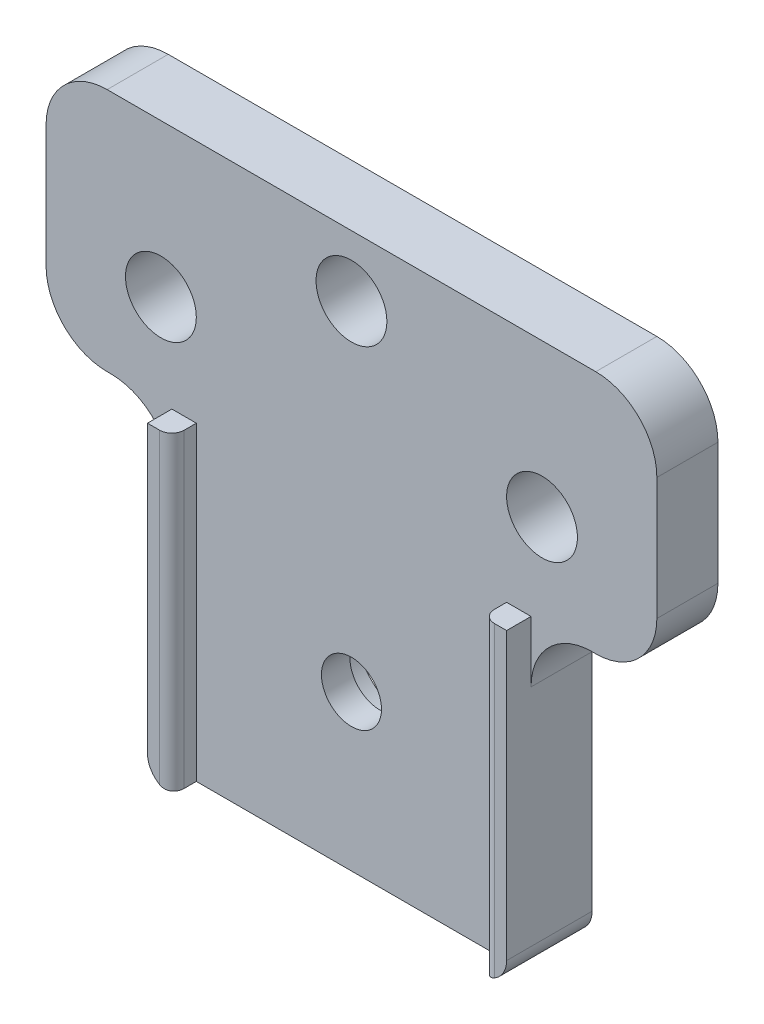
ISO-10303-21;
HEADER;
FILE_DESCRIPTION(('STEP AP214'),'2;1');
FILE_NAME('part.step','',(''),(''),'','','');
FILE_SCHEMA(('AUTOMOTIVE_DESIGN { 1 0 10303 214 1 1 1 1 }'));
ENDSEC;
DATA;
#1=APPLICATION_CONTEXT('core data for automotive mechanical design processes');
#2=APPLICATION_PROTOCOL_DEFINITION('international standard','automotive_design',2000,#1);
#3=PRODUCT_CONTEXT('',#1,'mechanical');
#4=PRODUCT('Part','Part','',(#3));
#5=PRODUCT_RELATED_PRODUCT_CATEGORY('part','',(#4));
#6=PRODUCT_DEFINITION_FORMATION('','',#4);
#7=PRODUCT_DEFINITION_CONTEXT('part definition',#1,'design');
#8=PRODUCT_DEFINITION('design','',#6,#7);
#9=PRODUCT_DEFINITION_SHAPE('','',#8);
#10=(LENGTH_UNIT() NAMED_UNIT(*) SI_UNIT(.MILLI.,.METRE.));
#11=(NAMED_UNIT(*) PLANE_ANGLE_UNIT() SI_UNIT($,.RADIAN.));
#12=(NAMED_UNIT(*) SI_UNIT($,.STERADIAN.) SOLID_ANGLE_UNIT());
#13=UNCERTAINTY_MEASURE_WITH_UNIT(LENGTH_MEASURE(1.E-05),#10,'distance_accuracy_value','');
#14=(GEOMETRIC_REPRESENTATION_CONTEXT(3) GLOBAL_UNCERTAINTY_ASSIGNED_CONTEXT((#13)) GLOBAL_UNIT_ASSIGNED_CONTEXT((#10,
#11,#12)) REPRESENTATION_CONTEXT('',''));
#15=CARTESIAN_POINT('',(0.,0.,0.));
#16=DIRECTION('',(0.,0.,1.));
#17=DIRECTION('',(1.,0.,0.));
#18=AXIS2_PLACEMENT_3D('',#15,#16,#17);
#19=CARTESIAN_POINT('',(0.,0.,5.));
#20=DIRECTION('',(0.,0.,1.));
#21=DIRECTION('',(1.,0.,0.));
#22=AXIS2_PLACEMENT_3D('',#19,#20,#21);
#23=PLANE('',#22);
#24=CARTESIAN_POINT('',(-15.6,12.7,5.));
#25=DIRECTION('',(0.,0.,1.));
#26=DIRECTION('',(1.,0.,0.));
#27=AXIS2_PLACEMENT_3D('',#24,#25,#26);
#28=CIRCLE('',#27,2.9);
#29=CARTESIAN_POINT('',(-12.7,12.7,5.));
#30=VERTEX_POINT('',#29);
#31=EDGE_CURVE('E550',#30,#30,#28,.T.);
#32=ORIENTED_EDGE('',*,*,#31,.F.);
#33=EDGE_LOOP('',(#32));
#34=FACE_BOUND('',#33,.T.);
#35=CARTESIAN_POINT('',(15.6,12.7,5.));
#36=DIRECTION('',(0.,0.,1.));
#37=DIRECTION('',(1.,0.,0.));
#38=AXIS2_PLACEMENT_3D('',#35,#36,#37);
#39=CIRCLE('',#38,2.9);
#40=CARTESIAN_POINT('',(18.5,12.7,5.));
#41=VERTEX_POINT('',#40);
#42=EDGE_CURVE('E552',#41,#41,#39,.T.);
#43=ORIENTED_EDGE('',*,*,#42,.F.);
#44=EDGE_LOOP('',(#43));
#45=FACE_BOUND('',#44,.T.);
#46=CARTESIAN_POINT('',(0.,20.2,5.));
#47=DIRECTION('',(0.,0.,1.));
#48=DIRECTION('',(1.,0.,0.));
#49=AXIS2_PLACEMENT_3D('',#46,#47,#48);
#50=CIRCLE('',#49,2.9);
#51=CARTESIAN_POINT('',(2.9,20.2,5.));
#52=VERTEX_POINT('',#51);
#53=EDGE_CURVE('E441',#52,#52,#50,.T.);
#54=ORIENTED_EDGE('',*,*,#53,.F.);
#55=EDGE_LOOP('',(#54));
#56=FACE_BOUND('',#55,.T.);
#57=CARTESIAN_POINT('',(0.,-7.49999999999999,5.));
#58=DIRECTION('',(0.,0.,1.));
#59=DIRECTION('',(1.,0.,0.));
#60=AXIS2_PLACEMENT_3D('',#57,#58,#59);
#61=CIRCLE('',#60,2.45745);
#62=CARTESIAN_POINT('',(2.45745,-7.49999999999999,5.));
#63=VERTEX_POINT('',#62);
#64=EDGE_CURVE('E415',#63,#63,#61,.T.);
#65=ORIENTED_EDGE('',*,*,#64,.F.);
#66=EDGE_LOOP('',(#65));
#67=FACE_BOUND('',#66,.T.);
#68=DIRECTION('',(0.,1.,0.));
#69=VECTOR('',#68,1.);
#70=CARTESIAN_POINT('',(25.,5.2,5.));
#71=LINE('',#70,#69);
#72=CARTESIAN_POINT('',(25.,10.2,5.));
#73=VERTEX_POINT('',#72);
#74=CARTESIAN_POINT('',(25.,20.2,5.));
#75=VERTEX_POINT('',#74);
#76=EDGE_CURVE('E456',#73,#75,#71,.T.);
#77=ORIENTED_EDGE('',*,*,#76,.T.);
#78=CARTESIAN_POINT('',(20.,20.2,5.));
#79=DIRECTION('',(0.,0.,1.));
#80=DIRECTION('',(1.,0.,0.));
#81=AXIS2_PLACEMENT_3D('',#78,#79,#80);
#82=CIRCLE('',#81,5.);
#83=CARTESIAN_POINT('',(20.,25.2,5.));
#84=VERTEX_POINT('',#83);
#85=EDGE_CURVE('E341',#75,#84,#82,.T.);
#86=ORIENTED_EDGE('',*,*,#85,.T.);
#87=DIRECTION('',(1.,0.,0.));
#88=VECTOR('',#87,1.);
#89=CARTESIAN_POINT('',(-25.,25.2,5.));
#90=LINE('',#89,#88);
#91=CARTESIAN_POINT('',(-20.,25.2,5.));
#92=VERTEX_POINT('',#91);
#93=EDGE_CURVE('E426',#92,#84,#90,.T.);
#94=ORIENTED_EDGE('',*,*,#93,.F.);
#95=CARTESIAN_POINT('',(-20.,20.2,5.));
#96=DIRECTION('',(0.,0.,1.));
#97=DIRECTION('',(1.,0.,0.));
#98=AXIS2_PLACEMENT_3D('',#95,#96,#97);
#99=CIRCLE('',#98,5.);
#100=CARTESIAN_POINT('',(-25.,20.2,5.));
#101=VERTEX_POINT('',#100);
#102=EDGE_CURVE('E339',#92,#101,#99,.T.);
#103=ORIENTED_EDGE('',*,*,#102,.T.);
#104=DIRECTION('',(0.,-1.,0.));
#105=VECTOR('',#104,1.);
#106=CARTESIAN_POINT('',(-25.,5.2,5.));
#107=LINE('',#106,#105);
#108=CARTESIAN_POINT('',(-25.,10.2,5.));
#109=VERTEX_POINT('',#108);
#110=EDGE_CURVE('E417',#101,#109,#107,.T.);
#111=ORIENTED_EDGE('',*,*,#110,.T.);
#112=CARTESIAN_POINT('',(-20.,10.2,5.));
#113=DIRECTION('',(0.,0.,1.));
#114=DIRECTION('',(1.,0.,0.));
#115=AXIS2_PLACEMENT_3D('',#112,#113,#114);
#116=CIRCLE('',#115,5.);
#117=CARTESIAN_POINT('',(-20.,5.2,5.));
#118=VERTEX_POINT('',#117);
#119=EDGE_CURVE('E335',#109,#118,#116,.T.);
#120=ORIENTED_EDGE('',*,*,#119,.T.);
#121=DIRECTION('',(1.,0.,0.));
#122=VECTOR('',#121,1.);
#123=CARTESIAN_POINT('',(25.,5.2,5.));
#124=LINE('',#123,#122);
#125=CARTESIAN_POINT('',(-19.7,5.2,5.));
#126=VERTEX_POINT('',#125);
#127=EDGE_CURVE('E461',#118,#126,#124,.T.);
#128=ORIENTED_EDGE('',*,*,#127,.T.);
#129=CARTESIAN_POINT('',(-19.7,0.200000000000006,5.));
#130=DIRECTION('',(0.,0.,1.));
#131=DIRECTION('',(1.,0.,0.));
#132=AXIS2_PLACEMENT_3D('',#129,#130,#131);
#133=CIRCLE('',#132,5.);
#134=CARTESIAN_POINT('',(-14.7,0.200000000000006,5.));
#135=VERTEX_POINT('',#134);
#136=EDGE_CURVE('E367',#126,#135,#133,.F.);
#137=ORIENTED_EDGE('',*,*,#136,.T.);
#138=DIRECTION('',(0.,-1.,0.));
#139=VECTOR('',#138,1.);
#140=CARTESIAN_POINT('',(-14.7,-20.2,5.));
#141=LINE('',#140,#139);
#142=CARTESIAN_POINT('',(-14.7,5.20000000000001,5.));
#143=VERTEX_POINT('',#142);
#144=EDGE_CURVE('E346',#143,#135,#141,.T.);
#145=ORIENTED_EDGE('',*,*,#144,.F.);
#146=DIRECTION('',(1.,0.,0.));
#147=VECTOR('',#146,1.);
#148=CARTESIAN_POINT('',(-14.7,5.20000000000001,5.));
#149=LINE('',#148,#147);
#150=CARTESIAN_POINT('',(-12.7,5.20000000000001,5.));
#151=VERTEX_POINT('',#150);
#152=EDGE_CURVE('E489',#143,#151,#149,.T.);
#153=ORIENTED_EDGE('',*,*,#152,.T.);
#154=DIRECTION('',(0.,-1.,0.));
#155=VECTOR('',#154,1.);
#156=CARTESIAN_POINT('',(-12.7,5.20000000000001,5.));
#157=LINE('',#156,#155);
#158=CARTESIAN_POINT('',(-12.7,-20.2,5.));
#159=VERTEX_POINT('',#158);
#160=EDGE_CURVE('E405',#151,#159,#157,.T.);
#161=ORIENTED_EDGE('',*,*,#160,.T.);
#162=DIRECTION('',(1.,0.,0.));
#163=VECTOR('',#162,1.);
#164=CARTESIAN_POINT('',(14.7,-20.2,5.));
#165=LINE('',#164,#163);
#166=CARTESIAN_POINT('',(12.7,-20.2,5.));
#167=VERTEX_POINT('',#166);
#168=EDGE_CURVE('E385',#159,#167,#165,.T.);
#169=ORIENTED_EDGE('',*,*,#168,.T.);
#170=DIRECTION('',(0.,-1.,0.));
#171=VECTOR('',#170,1.);
#172=CARTESIAN_POINT('',(12.7,5.20000000000001,5.));
#173=LINE('',#172,#171);
#174=CARTESIAN_POINT('',(12.7,5.20000000000001,5.));
#175=VERTEX_POINT('',#174);
#176=EDGE_CURVE('E202',#175,#167,#173,.T.);
#177=ORIENTED_EDGE('',*,*,#176,.F.);
#178=DIRECTION('',(-1.,0.,0.));
#179=VECTOR('',#178,1.);
#180=CARTESIAN_POINT('',(14.7,5.20000000000001,5.));
#181=LINE('',#180,#179);
#182=CARTESIAN_POINT('',(14.7,5.20000000000001,5.));
#183=VERTEX_POINT('',#182);
#184=EDGE_CURVE('E476',#183,#175,#181,.T.);
#185=ORIENTED_EDGE('',*,*,#184,.F.);
#186=DIRECTION('',(0.,1.,0.));
#187=VECTOR('',#186,1.);
#188=CARTESIAN_POINT('',(14.7,-20.2,5.));
#189=LINE('',#188,#187);
#190=CARTESIAN_POINT('',(14.7,0.200000000000006,5.));
#191=VERTEX_POINT('',#190);
#192=EDGE_CURVE('E355',#191,#183,#189,.T.);
#193=ORIENTED_EDGE('',*,*,#192,.F.);
#194=CARTESIAN_POINT('',(19.7,0.200000000000006,5.));
#195=DIRECTION('',(0.,0.,1.));
#196=DIRECTION('',(1.,0.,0.));
#197=AXIS2_PLACEMENT_3D('',#194,#195,#196);
#198=CIRCLE('',#197,5.);
#199=CARTESIAN_POINT('',(19.7,5.2,5.));
#200=VERTEX_POINT('',#199);
#201=EDGE_CURVE('E369',#191,#200,#198,.F.);
#202=ORIENTED_EDGE('',*,*,#201,.T.);
#203=CARTESIAN_POINT('',(20.,5.2,5.));
#204=VERTEX_POINT('',#203);
#205=EDGE_CURVE('E460',#200,#204,#124,.T.);
#206=ORIENTED_EDGE('',*,*,#205,.T.);
#207=CARTESIAN_POINT('',(20.,10.2,5.));
#208=DIRECTION('',(0.,0.,1.));
#209=DIRECTION('',(1.,0.,0.));
#210=AXIS2_PLACEMENT_3D('',#207,#208,#209);
#211=CIRCLE('',#210,5.);
#212=EDGE_CURVE('E337',#204,#73,#211,.T.);
#213=ORIENTED_EDGE('',*,*,#212,.T.);
#214=EDGE_LOOP('',(#77,#86,#94,#103,#111,#120,#128,#137,#145,#153,#161,#169,#177,#185,#193,#202,
#206,#213));
#215=FACE_BOUND('',#214,.T.);
#216=ADVANCED_FACE('F33',(#34,#45,#56,#67,#215),#23,.T.);
#217=CARTESIAN_POINT('',(-14.7,-20.2,5.));
#218=DIRECTION('',(1.,0.,0.));
#219=DIRECTION('',(0.,0.,-1.));
#220=AXIS2_PLACEMENT_3D('',#217,#218,#219);
#221=PLANE('',#220);
#222=DIRECTION('',(0.,-1.,0.));
#223=VECTOR('',#222,1.);
#224=CARTESIAN_POINT('',(-14.7,-20.2,0.));
#225=LINE('',#224,#223);
#226=CARTESIAN_POINT('',(-14.7,0.200000000000006,0.));
#227=VERTEX_POINT('',#226);
#228=CARTESIAN_POINT('',(-14.7,-18.2,0.));
#229=VERTEX_POINT('',#228);
#230=EDGE_CURVE('E393',#227,#229,#225,.T.);
#231=ORIENTED_EDGE('',*,*,#230,.T.);
#232=DIRECTION('',(0.,0.,-1.));
#233=VECTOR('',#232,1.);
#234=CARTESIAN_POINT('',(-14.7,-18.2,5.));
#235=LINE('',#234,#233);
#236=CARTESIAN_POINT('',(-14.7,-18.2,7.));
#237=VERTEX_POINT('',#236);
#238=EDGE_CURVE('E61',#229,#237,#235,.F.);
#239=ORIENTED_EDGE('',*,*,#238,.T.);
#240=DIRECTION('',(0.,-1.,0.));
#241=VECTOR('',#240,1.);
#242=CARTESIAN_POINT('',(-14.7,5.20000000000001,7.));
#243=LINE('',#242,#241);
#244=CARTESIAN_POINT('',(-14.7,5.20000000000001,7.));
#245=VERTEX_POINT('',#244);
#246=EDGE_CURVE('E408',#245,#237,#243,.T.);
#247=ORIENTED_EDGE('',*,*,#246,.F.);
#248=DIRECTION('',(0.,0.,1.));
#249=VECTOR('',#248,1.);
#250=CARTESIAN_POINT('',(-14.7,5.20000000000001,5.));
#251=LINE('',#250,#249);
#252=EDGE_CURVE('E492',#143,#245,#251,.T.);
#253=ORIENTED_EDGE('',*,*,#252,.F.);
#254=ORIENTED_EDGE('',*,*,#144,.T.);
#255=DIRECTION('',(0.,0.,-1.));
#256=VECTOR('',#255,1.);
#257=CARTESIAN_POINT('',(-14.7,0.200000000000006,5.));
#258=LINE('',#257,#256);
#259=EDGE_CURVE('E349',#135,#227,#258,.T.);
#260=ORIENTED_EDGE('',*,*,#259,.T.);
#261=EDGE_LOOP('',(#231,#239,#247,#253,#254,#260));
#262=FACE_BOUND('',#261,.T.);
#263=ADVANCED_FACE('F266',(#262),#221,.F.);
#264=CARTESIAN_POINT('',(14.7,-20.2,5.));
#265=DIRECTION('',(0.,1.,0.));
#266=DIRECTION('',(-1.,0.,0.));
#267=AXIS2_PLACEMENT_3D('',#264,#265,#266);
#268=PLANE('',#267);
#269=DIRECTION('',(1.,0.,0.));
#270=VECTOR('',#269,1.);
#271=CARTESIAN_POINT('',(14.7,-20.2,0.));
#272=LINE('',#271,#270);
#273=CARTESIAN_POINT('',(-12.7,-20.2,0.));
#274=VERTEX_POINT('',#273);
#275=CARTESIAN_POINT('',(12.7,-20.2,0.));
#276=VERTEX_POINT('',#275);
#277=EDGE_CURVE('E383',#274,#276,#272,.T.);
#278=ORIENTED_EDGE('',*,*,#277,.T.);
#279=DIRECTION('',(0.,0.,-1.));
#280=VECTOR('',#279,1.);
#281=CARTESIAN_POINT('',(12.7,-20.2,5.));
#282=LINE('',#281,#280);
#283=EDGE_CURVE('E221',#276,#167,#282,.F.);
#284=ORIENTED_EDGE('',*,*,#283,.T.);
#285=ORIENTED_EDGE('',*,*,#168,.F.);
#286=DIRECTION('',(0.,0.,-1.));
#287=VECTOR('',#286,1.);
#288=CARTESIAN_POINT('',(-12.7,-20.2,5.));
#289=LINE('',#288,#287);
#290=EDGE_CURVE('E224',#159,#274,#289,.T.);
#291=ORIENTED_EDGE('',*,*,#290,.T.);
#292=EDGE_LOOP('',(#278,#284,#285,#291));
#293=FACE_BOUND('',#292,.T.);
#294=ADVANCED_FACE('F274',(#293),#268,.F.);
#295=CARTESIAN_POINT('',(14.7,-20.2,5.));
#296=DIRECTION('',(-1.,0.,0.));
#297=DIRECTION('',(0.,0.,1.));
#298=AXIS2_PLACEMENT_3D('',#295,#296,#297);
#299=PLANE('',#298);
#300=DIRECTION('',(0.,-1.,0.));
#301=VECTOR('',#300,1.);
#302=CARTESIAN_POINT('',(14.7,5.20000000000001,7.));
#303=LINE('',#302,#301);
#304=CARTESIAN_POINT('',(14.7,5.20000000000001,7.));
#305=VERTEX_POINT('',#304);
#306=CARTESIAN_POINT('',(14.7,-18.2,7.));
#307=VERTEX_POINT('',#306);
#308=EDGE_CURVE('E468',#305,#307,#303,.T.);
#309=ORIENTED_EDGE('',*,*,#308,.T.);
#310=DIRECTION('',(0.,0.,-1.));
#311=VECTOR('',#310,1.);
#312=CARTESIAN_POINT('',(14.7,-18.2,5.));
#313=LINE('',#312,#311);
#314=CARTESIAN_POINT('',(14.7,-18.2,0.));
#315=VERTEX_POINT('',#314);
#316=EDGE_CURVE('E374',#307,#315,#313,.T.);
#317=ORIENTED_EDGE('',*,*,#316,.T.);
#318=DIRECTION('',(0.,1.,0.));
#319=VECTOR('',#318,1.);
#320=CARTESIAN_POINT('',(14.7,-20.2,0.));
#321=LINE('',#320,#319);
#322=CARTESIAN_POINT('',(14.7,0.200000000000006,0.));
#323=VERTEX_POINT('',#322);
#324=EDGE_CURVE('E392',#315,#323,#321,.T.);
#325=ORIENTED_EDGE('',*,*,#324,.T.);
#326=DIRECTION('',(0.,0.,1.));
#327=VECTOR('',#326,1.);
#328=CARTESIAN_POINT('',(14.7,0.200000000000006,5.));
#329=LINE('',#328,#327);
#330=EDGE_CURVE('E357',#323,#191,#329,.T.);
#331=ORIENTED_EDGE('',*,*,#330,.T.);
#332=ORIENTED_EDGE('',*,*,#192,.T.);
#333=DIRECTION('',(0.,0.,1.));
#334=VECTOR('',#333,1.);
#335=CARTESIAN_POINT('',(14.7,5.20000000000001,5.));
#336=LINE('',#335,#334);
#337=EDGE_CURVE('E469',#183,#305,#336,.T.);
#338=ORIENTED_EDGE('',*,*,#337,.T.);
#339=EDGE_LOOP('',(#309,#317,#325,#331,#332,#338));
#340=FACE_BOUND('',#339,.T.);
#341=ADVANCED_FACE('F270',(#340),#299,.F.);
#342=CARTESIAN_POINT('',(0.,0.,0.));
#343=DIRECTION('',(0.,0.,1.));
#344=DIRECTION('',(1.,0.,0.));
#345=AXIS2_PLACEMENT_3D('',#342,#343,#344);
#346=PLANE('',#345);
#347=CARTESIAN_POINT('',(-15.6,12.7,0.));
#348=DIRECTION('',(0.,0.,1.));
#349=DIRECTION('',(1.,0.,0.));
#350=AXIS2_PLACEMENT_3D('',#347,#348,#349);
#351=CIRCLE('',#350,2.9);
#352=CARTESIAN_POINT('',(-12.7,12.7,0.));
#353=VERTEX_POINT('',#352);
#354=EDGE_CURVE('E547',#353,#353,#351,.T.);
#355=ORIENTED_EDGE('',*,*,#354,.T.);
#356=EDGE_LOOP('',(#355));
#357=FACE_BOUND('',#356,.T.);
#358=CARTESIAN_POINT('',(15.6,12.7,0.));
#359=DIRECTION('',(0.,0.,1.));
#360=DIRECTION('',(1.,0.,0.));
#361=AXIS2_PLACEMENT_3D('',#358,#359,#360);
#362=CIRCLE('',#361,2.9);
#363=CARTESIAN_POINT('',(18.5,12.7,0.));
#364=VERTEX_POINT('',#363);
#365=EDGE_CURVE('E557',#364,#364,#362,.T.);
#366=ORIENTED_EDGE('',*,*,#365,.T.);
#367=EDGE_LOOP('',(#366));
#368=FACE_BOUND('',#367,.T.);
#369=CARTESIAN_POINT('',(0.,20.2,0.));
#370=DIRECTION('',(0.,0.,1.));
#371=DIRECTION('',(1.,0.,0.));
#372=AXIS2_PLACEMENT_3D('',#369,#370,#371);
#373=CIRCLE('',#372,2.9);
#374=CARTESIAN_POINT('',(2.9,20.2,0.));
#375=VERTEX_POINT('',#374);
#376=EDGE_CURVE('E436',#375,#375,#373,.T.);
#377=ORIENTED_EDGE('',*,*,#376,.T.);
#378=EDGE_LOOP('',(#377));
#379=FACE_BOUND('',#378,.T.);
#380=CARTESIAN_POINT('',(0.,-7.49999999999999,0.));
#381=DIRECTION('',(0.,0.,-1.));
#382=DIRECTION('',(-1.,0.,0.));
#383=AXIS2_PLACEMENT_3D('',#380,#381,#382);
#384=CIRCLE('',#383,4.76249999999999);
#385=CARTESIAN_POINT('',(-4.76249999999999,-7.49999999999999,0.));
#386=VERTEX_POINT('',#385);
#387=EDGE_CURVE('E438',#386,#386,#384,.T.);
#388=ORIENTED_EDGE('',*,*,#387,.F.);
#389=EDGE_LOOP('',(#388));
#390=FACE_BOUND('',#389,.T.);
#391=ORIENTED_EDGE('',*,*,#324,.F.);
#392=CARTESIAN_POINT('',(12.7,-18.2,0.));
#393=DIRECTION('',(0.,0.,1.));
#394=DIRECTION('',(1.,0.,0.));
#395=AXIS2_PLACEMENT_3D('',#392,#393,#394);
#396=CIRCLE('',#395,2.);
#397=EDGE_CURVE('E379',#315,#276,#396,.F.);
#398=ORIENTED_EDGE('',*,*,#397,.T.);
#399=ORIENTED_EDGE('',*,*,#277,.F.);
#400=CARTESIAN_POINT('',(-12.7,-18.2,0.));
#401=DIRECTION('',(0.,0.,1.));
#402=DIRECTION('',(1.,0.,0.));
#403=AXIS2_PLACEMENT_3D('',#400,#401,#402);
#404=CIRCLE('',#403,2.);
#405=EDGE_CURVE('E377',#274,#229,#404,.F.);
#406=ORIENTED_EDGE('',*,*,#405,.T.);
#407=ORIENTED_EDGE('',*,*,#230,.F.);
#408=CARTESIAN_POINT('',(-19.7,0.200000000000006,0.));
#409=DIRECTION('',(0.,0.,1.));
#410=DIRECTION('',(1.,0.,0.));
#411=AXIS2_PLACEMENT_3D('',#408,#409,#410);
#412=CIRCLE('',#411,5.);
#413=CARTESIAN_POINT('',(-19.7,5.2,0.));
#414=VERTEX_POINT('',#413);
#415=EDGE_CURVE('E365',#227,#414,#412,.T.);
#416=ORIENTED_EDGE('',*,*,#415,.T.);
#417=DIRECTION('',(-1.,0.,0.));
#418=VECTOR('',#417,1.);
#419=CARTESIAN_POINT('',(25.,5.2,0.));
#420=LINE('',#419,#418);
#421=CARTESIAN_POINT('',(-20.,5.2,0.));
#422=VERTEX_POINT('',#421);
#423=EDGE_CURVE('E458',#414,#422,#420,.T.);
#424=ORIENTED_EDGE('',*,*,#423,.T.);
#425=CARTESIAN_POINT('',(-20.,10.2,0.));
#426=DIRECTION('',(0.,0.,1.));
#427=DIRECTION('',(1.,0.,0.));
#428=AXIS2_PLACEMENT_3D('',#425,#426,#427);
#429=CIRCLE('',#428,5.);
#430=CARTESIAN_POINT('',(-25.,10.2,0.));
#431=VERTEX_POINT('',#430);
#432=EDGE_CURVE('E310',#422,#431,#429,.F.);
#433=ORIENTED_EDGE('',*,*,#432,.T.);
#434=DIRECTION('',(0.,1.,0.));
#435=VECTOR('',#434,1.);
#436=CARTESIAN_POINT('',(-25.,5.2,0.));
#437=LINE('',#436,#435);
#438=CARTESIAN_POINT('',(-25.,20.2,0.));
#439=VERTEX_POINT('',#438);
#440=EDGE_CURVE('E455',#431,#439,#437,.T.);
#441=ORIENTED_EDGE('',*,*,#440,.T.);
#442=CARTESIAN_POINT('',(-20.,20.2,0.));
#443=DIRECTION('',(0.,0.,1.));
#444=DIRECTION('',(1.,0.,0.));
#445=AXIS2_PLACEMENT_3D('',#442,#443,#444);
#446=CIRCLE('',#445,5.);
#447=CARTESIAN_POINT('',(-20.,25.2,0.));
#448=VERTEX_POINT('',#447);
#449=EDGE_CURVE('E321',#439,#448,#446,.F.);
#450=ORIENTED_EDGE('',*,*,#449,.T.);
#451=DIRECTION('',(-1.,0.,0.));
#452=VECTOR('',#451,1.);
#453=CARTESIAN_POINT('',(-25.,25.2,0.));
#454=LINE('',#453,#452);
#455=CARTESIAN_POINT('',(20.,25.2,0.));
#456=VERTEX_POINT('',#455);
#457=EDGE_CURVE('E429',#456,#448,#454,.T.);
#458=ORIENTED_EDGE('',*,*,#457,.F.);
#459=CARTESIAN_POINT('',(20.,20.2,0.));
#460=DIRECTION('',(0.,0.,1.));
#461=DIRECTION('',(1.,0.,0.));
#462=AXIS2_PLACEMENT_3D('',#459,#460,#461);
#463=CIRCLE('',#462,5.);
#464=CARTESIAN_POINT('',(25.,20.2,0.));
#465=VERTEX_POINT('',#464);
#466=EDGE_CURVE('E329',#456,#465,#463,.F.);
#467=ORIENTED_EDGE('',*,*,#466,.T.);
#468=DIRECTION('',(0.,-1.,0.));
#469=VECTOR('',#468,1.);
#470=CARTESIAN_POINT('',(25.,5.2,0.));
#471=LINE('',#470,#469);
#472=CARTESIAN_POINT('',(25.,10.2,0.));
#473=VERTEX_POINT('',#472);
#474=EDGE_CURVE('E452',#465,#473,#471,.T.);
#475=ORIENTED_EDGE('',*,*,#474,.T.);
#476=CARTESIAN_POINT('',(20.,10.2,0.));
#477=DIRECTION('',(0.,0.,1.));
#478=DIRECTION('',(1.,0.,0.));
#479=AXIS2_PLACEMENT_3D('',#476,#477,#478);
#480=CIRCLE('',#479,5.);
#481=CARTESIAN_POINT('',(20.,5.2,0.));
#482=VERTEX_POINT('',#481);
#483=EDGE_CURVE('E318',#473,#482,#480,.F.);
#484=ORIENTED_EDGE('',*,*,#483,.T.);
#485=CARTESIAN_POINT('',(19.7,5.2,0.));
#486=VERTEX_POINT('',#485);
#487=EDGE_CURVE('E465',#482,#486,#420,.T.);
#488=ORIENTED_EDGE('',*,*,#487,.T.);
#489=CARTESIAN_POINT('',(19.7,0.200000000000006,0.));
#490=DIRECTION('',(0.,0.,1.));
#491=DIRECTION('',(1.,0.,0.));
#492=AXIS2_PLACEMENT_3D('',#489,#490,#491);
#493=CIRCLE('',#492,5.);
#494=EDGE_CURVE('E371',#486,#323,#493,.T.);
#495=ORIENTED_EDGE('',*,*,#494,.T.);
#496=EDGE_LOOP('',(#391,#398,#399,#406,#407,#416,#424,#433,#441,#450,#458,#467,#475,#484,#488,#495));
#497=FACE_BOUND('',#496,.T.);
#498=ADVANCED_FACE('F263',(#357,#368,#379,#390,#497),#346,.F.);
#499=CARTESIAN_POINT('',(-14.7,5.20000000000001,7.));
#500=DIRECTION('',(0.,0.,-1.));
#501=DIRECTION('',(-1.,0.,0.));
#502=AXIS2_PLACEMENT_3D('',#499,#500,#501);
#503=PLANE('',#502);
#504=ORIENTED_EDGE('',*,*,#246,.T.);
#505=CARTESIAN_POINT('',(-12.7,-18.2,7.));
#506=DIRECTION('',(0.,0.,-1.));
#507=DIRECTION('',(-1.,0.,0.));
#508=AXIS2_PLACEMENT_3D('',#505,#506,#507);
#509=CIRCLE('',#508,2.);
#510=CARTESIAN_POINT('',(-13.7,-19.9320508075689,7.));
#511=VERTEX_POINT('',#510);
#512=EDGE_CURVE('E47',#237,#511,#509,.F.);
#513=ORIENTED_EDGE('',*,*,#512,.T.);
#514=DIRECTION('',(0.,-1.,0.));
#515=VECTOR('',#514,1.);
#516=CARTESIAN_POINT('',(-13.7,5.20000000000001,7.));
#517=LINE('',#516,#515);
#518=CARTESIAN_POINT('',(-13.7,5.20000000000001,7.));
#519=VERTEX_POINT('',#518);
#520=EDGE_CURVE('E400',#519,#511,#517,.T.);
#521=ORIENTED_EDGE('',*,*,#520,.F.);
#522=DIRECTION('',(1.,0.,0.));
#523=VECTOR('',#522,1.);
#524=CARTESIAN_POINT('',(-14.7,5.20000000000001,7.));
#525=LINE('',#524,#523);
#526=EDGE_CURVE('E484',#245,#519,#525,.T.);
#527=ORIENTED_EDGE('',*,*,#526,.F.);
#528=EDGE_LOOP('',(#504,#513,#521,#527));
#529=FACE_BOUND('',#528,.T.);
#530=ADVANCED_FACE('F259',(#529),#503,.F.);
#531=CARTESIAN_POINT('',(-13.7,5.20000000000001,6.));
#532=DIRECTION('',(0.,-1.,0.));
#533=DIRECTION('',(1.,0.,0.));
#534=AXIS2_PLACEMENT_3D('',#531,#532,#533);
#535=CYLINDRICAL_SURFACE('',#534,1.);
#536=ORIENTED_EDGE('',*,*,#520,.T.);
#537=CARTESIAN_POINT('',(-13.7,-19.9320508075689,7.));
#538=CARTESIAN_POINT('',(-13.6759058902306,-19.9459635960974,6.99999952879958));
#539=CARTESIAN_POINT('',(-13.651524614497,-19.9593667706739,6.99912814145026));
#540=CARTESIAN_POINT('',(-13.6023202707131,-19.9851020388507,6.99552438099685));
#541=CARTESIAN_POINT('',(-13.5774969397126,-19.997433467427,6.99279086159609));
#542=CARTESIAN_POINT('',(-13.5025913875008,-20.032725311226,6.98161715737378));
#543=CARTESIAN_POINT('',(-13.452089994246,-20.0539738554532,6.97020366685951));
#544=CARTESIAN_POINT('',(-13.3516797152979,-20.0916143075691,6.93885617769222));
#545=CARTESIAN_POINT('',(-13.3017739657713,-20.1079866606304,6.91888863469894));
#546=CARTESIAN_POINT('',(-13.2048690791744,-20.1358839373047,6.87050046954054));
#547=CARTESIAN_POINT('',(-13.1578655948379,-20.1474162687294,6.84209287981183));
#548=CARTESIAN_POINT('',(-13.0712942815031,-20.1657027308121,6.77937052268846));
#549=CARTESIAN_POINT('',(-13.0314512814987,-20.1726987878365,6.74550358993334));
#550=CARTESIAN_POINT('',(-12.9573326330091,-20.1837306006306,6.67170111004314));
#551=CARTESIAN_POINT('',(-12.9230605241553,-20.1877644799732,6.63176173554612));
#552=CARTESIAN_POINT('',(-12.8606473122264,-20.1937890695138,6.54620278251953));
#553=CARTESIAN_POINT('',(-12.8326162800986,-20.1957450954533,6.5005006073505));
#554=CARTESIAN_POINT('',(-12.784203893594,-20.1983742082656,6.40518681505302));
#555=CARTESIAN_POINT('',(-12.7638226489579,-20.1990472767342,6.35557514185289));
#556=CARTESIAN_POINT('',(-12.7318160640422,-20.19980923651,6.25549913692761));
#557=CARTESIAN_POINT('',(-12.7199089134073,-20.1999177730125,6.20512561195196));
#558=CARTESIAN_POINT('',(-12.7079771656163,-20.1999875220482,6.12868019813782));
#559=CARTESIAN_POINT('',(-12.704988070982,-20.199995245681,6.1030396302356));
#560=CARTESIAN_POINT('',(-12.7009994605602,-20.2000002730765,6.05160278173309));
#561=CARTESIAN_POINT('',(-12.7000000532085,-20.1999975762713,6.025806492723));
#562=CARTESIAN_POINT('',(-12.7,-20.2,6.));
#563=B_SPLINE_CURVE_WITH_KNOTS('',3,(#537,#538,#539,#540,#541,#542,#543,#544,#545,#546,#547,
#548,#549,#550,#551,#552,#553,#554,#555,#556,#557,#558,#559,#560,#561,#562),.UNSPECIFIED.,.F.,
.F.,(4,2,2,2,2,2,2,2,2,2,2,2,4),(0.,0.0834312350327753,0.166913875374152,0.333935213231278,
0.501617601138473,0.669042401376242,0.826581466672789,0.984220241103292,1.14445090900904,
1.30468387542886,1.45930167535492,1.53667730239239,1.61405714620784),.UNSPECIFIED.);
#564=CARTESIAN_POINT('',(-12.7,-20.2,5.99999999999999));
#565=VERTEX_POINT('',#564);
#566=EDGE_CURVE('E11',#511,#565,#563,.T.);
#567=ORIENTED_EDGE('',*,*,#566,.T.);
#568=DIRECTION('',(0.,-1.,0.));
#569=VECTOR('',#568,1.);
#570=CARTESIAN_POINT('',(-12.7,5.20000000000001,5.99999999999999));
#571=LINE('',#570,#569);
#572=CARTESIAN_POINT('',(-12.7,5.20000000000001,5.99999999999999));
#573=VERTEX_POINT('',#572);
#574=EDGE_CURVE('E398',#573,#565,#571,.T.);
#575=ORIENTED_EDGE('',*,*,#574,.F.);
#576=CARTESIAN_POINT('',(-13.7,5.20000000000001,6.));
#577=DIRECTION('',(0.,-1.,0.));
#578=DIRECTION('',(1.,0.,0.));
#579=AXIS2_PLACEMENT_3D('',#576,#577,#578);
#580=CIRCLE('',#579,1.);
#581=EDGE_CURVE('E486',#573,#519,#580,.T.);
#582=ORIENTED_EDGE('',*,*,#581,.T.);
#583=EDGE_LOOP('',(#536,#567,#575,#582));
#584=FACE_BOUND('',#583,.T.);
#585=ADVANCED_FACE('F254',(#584),#535,.T.);
#586=CARTESIAN_POINT('',(-12.7,5.20000000000001,5.));
#587=DIRECTION('',(1.,0.,0.));
#588=DIRECTION('',(0.,1.,0.));
#589=AXIS2_PLACEMENT_3D('',#586,#587,#588);
#590=PLANE('',#589);
#591=DIRECTION('',(0.,0.,1.));
#592=VECTOR('',#591,1.);
#593=CARTESIAN_POINT('',(-12.7,-20.2,5.));
#594=LINE('',#593,#592);
#595=EDGE_CURVE('E206',#159,#565,#594,.T.);
#596=ORIENTED_EDGE('',*,*,#595,.F.);
#597=ORIENTED_EDGE('',*,*,#160,.F.);
#598=DIRECTION('',(0.,0.,1.));
#599=VECTOR('',#598,1.);
#600=CARTESIAN_POINT('',(-12.7,5.20000000000001,5.));
#601=LINE('',#600,#599);
#602=EDGE_CURVE('E404',#151,#573,#601,.T.);
#603=ORIENTED_EDGE('',*,*,#602,.T.);
#604=ORIENTED_EDGE('',*,*,#574,.T.);
#605=EDGE_LOOP('',(#596,#597,#603,#604));
#606=FACE_BOUND('',#605,.T.);
#607=ADVANCED_FACE('F251',(#606),#590,.T.);
#608=CARTESIAN_POINT('',(-13.7,5.20000000000001,6.));
#609=DIRECTION('',(0.,-1.,0.));
#610=DIRECTION('',(1.,0.,0.));
#611=AXIS2_PLACEMENT_3D('',#608,#609,#610);
#612=PLANE('',#611);
#613=ORIENTED_EDGE('',*,*,#526,.T.);
#614=ORIENTED_EDGE('',*,*,#581,.F.);
#615=ORIENTED_EDGE('',*,*,#602,.F.);
#616=ORIENTED_EDGE('',*,*,#152,.F.);
#617=ORIENTED_EDGE('',*,*,#252,.T.);
#618=EDGE_LOOP('',(#613,#614,#615,#616,#617));
#619=FACE_BOUND('',#618,.T.);
#620=ADVANCED_FACE('F248',(#619),#612,.F.);
#621=CARTESIAN_POINT('',(14.7,5.20000000000001,7.));
#622=DIRECTION('',(0.,0.,1.));
#623=DIRECTION('',(1.,0.,0.));
#624=AXIS2_PLACEMENT_3D('',#621,#622,#623);
#625=PLANE('',#624);
#626=DIRECTION('',(0.,-1.,0.));
#627=VECTOR('',#626,1.);
#628=CARTESIAN_POINT('',(13.7,5.20000000000001,7.));
#629=LINE('',#628,#627);
#630=CARTESIAN_POINT('',(13.7,5.20000000000001,7.));
#631=VERTEX_POINT('',#630);
#632=CARTESIAN_POINT('',(13.7,-19.9320508075689,7.));
#633=VERTEX_POINT('',#632);
#634=EDGE_CURVE('E215',#631,#633,#629,.T.);
#635=ORIENTED_EDGE('',*,*,#634,.T.);
#636=CARTESIAN_POINT('',(12.7,-18.2,7.));
#637=DIRECTION('',(0.,0.,1.));
#638=DIRECTION('',(1.,0.,0.));
#639=AXIS2_PLACEMENT_3D('',#636,#637,#638);
#640=CIRCLE('',#639,2.);
#641=EDGE_CURVE('E220',#633,#307,#640,.T.);
#642=ORIENTED_EDGE('',*,*,#641,.T.);
#643=ORIENTED_EDGE('',*,*,#308,.F.);
#644=DIRECTION('',(-1.,0.,0.));
#645=VECTOR('',#644,1.);
#646=CARTESIAN_POINT('',(14.7,5.20000000000001,7.));
#647=LINE('',#646,#645);
#648=EDGE_CURVE('E207',#305,#631,#647,.T.);
#649=ORIENTED_EDGE('',*,*,#648,.T.);
#650=EDGE_LOOP('',(#635,#642,#643,#649));
#651=FACE_BOUND('',#650,.T.);
#652=ADVANCED_FACE('F240',(#651),#625,.T.);
#653=CARTESIAN_POINT('',(12.7,5.20000000000001,5.));
#654=DIRECTION('',(1.,0.,0.));
#655=DIRECTION('',(0.,1.,0.));
#656=AXIS2_PLACEMENT_3D('',#653,#654,#655);
#657=PLANE('',#656);
#658=DIRECTION('',(0.,0.,1.));
#659=VECTOR('',#658,1.);
#660=CARTESIAN_POINT('',(12.7,-20.2,5.));
#661=LINE('',#660,#659);
#662=CARTESIAN_POINT('',(12.7,-20.2,5.99999999999999));
#663=VERTEX_POINT('',#662);
#664=EDGE_CURVE('E196',#167,#663,#661,.T.);
#665=ORIENTED_EDGE('',*,*,#664,.T.);
#666=DIRECTION('',(0.,-1.,0.));
#667=VECTOR('',#666,1.);
#668=CARTESIAN_POINT('',(12.7,5.20000000000001,5.99999999999999));
#669=LINE('',#668,#667);
#670=CARTESIAN_POINT('',(12.7,5.20000000000001,5.99999999999999));
#671=VERTEX_POINT('',#670);
#672=EDGE_CURVE('E200',#671,#663,#669,.T.);
#673=ORIENTED_EDGE('',*,*,#672,.F.);
#674=DIRECTION('',(0.,0.,1.));
#675=VECTOR('',#674,1.);
#676=CARTESIAN_POINT('',(12.7,5.20000000000001,5.));
#677=LINE('',#676,#675);
#678=EDGE_CURVE('E479',#175,#671,#677,.T.);
#679=ORIENTED_EDGE('',*,*,#678,.F.);
#680=ORIENTED_EDGE('',*,*,#176,.T.);
#681=EDGE_LOOP('',(#665,#673,#679,#680));
#682=FACE_BOUND('',#681,.T.);
#683=ADVANCED_FACE('F198',(#682),#657,.F.);
#684=CARTESIAN_POINT('',(13.7,5.20000000000001,6.));
#685=DIRECTION('',(0.,-1.,0.));
#686=DIRECTION('',(1.,0.,0.));
#687=AXIS2_PLACEMENT_3D('',#684,#685,#686);
#688=CYLINDRICAL_SURFACE('',#687,1.);
#689=ORIENTED_EDGE('',*,*,#672,.T.);
#690=CARTESIAN_POINT('',(12.7,-20.2,6.));
#691=CARTESIAN_POINT('',(12.7000001965565,-20.1999966154225,6.02806493065701));
#692=CARTESIAN_POINT('',(12.7011822011686,-20.2000003816994,6.05611643589703));
#693=CARTESIAN_POINT('',(12.7058977948124,-20.1999933526908,6.11201998942126));
#694=CARTESIAN_POINT('',(12.709431295691,-20.1999825579512,6.13987204514289));
#695=CARTESIAN_POINT('',(12.7235298798611,-20.1998851203458,6.22280713255127));
#696=CARTESIAN_POINT('',(12.7375931091928,-20.1997335539424,6.27733703304272));
#697=CARTESIAN_POINT('',(12.7746579532952,-20.1986910976103,6.38327174323565));
#698=CARTESIAN_POINT('',(12.797665075371,-20.1977997517693,6.43467460482915));
#699=CARTESIAN_POINT('',(12.8519441753011,-20.1944045544857,6.53286465829716));
#700=CARTESIAN_POINT('',(12.8832148302458,-20.1919009610559,6.57965258733155));
#701=CARTESIAN_POINT('',(12.9526702303051,-20.1842786657881,6.66676018073099));
#702=CARTESIAN_POINT('',(12.9907807696593,-20.1791870498311,6.70714126631049));
#703=CARTESIAN_POINT('',(13.072763609404,-20.1653926324133,6.78077216508378));
#704=CARTESIAN_POINT('',(13.1166313235852,-20.156692693577,6.81402759968864));
#705=CARTESIAN_POINT('',(13.2065309381127,-20.1353216210092,6.87132854523399));
#706=CARTESIAN_POINT('',(13.2524003870856,-20.1228279130689,6.89569573602958));
#707=CARTESIAN_POINT('',(13.3461744634893,-20.0933767891017,6.93671189675165));
#708=CARTESIAN_POINT('',(13.3940811091903,-20.076414855694,6.95335300830067));
#709=CARTESIAN_POINT('',(13.4856520550736,-20.0398217146731,6.97779780388132));
#710=CARTESIAN_POINT('',(13.5292981329557,-20.0205834719676,6.98627748237431));
#711=CARTESIAN_POINT('',(13.6156153931366,-19.9787604407517,6.99738852634805));
#712=CARTESIAN_POINT('',(13.6582884707681,-19.9561829408673,7.00003243434071));
#713=CARTESIAN_POINT('',(13.7,-19.9320508075689,7.));
#714=B_SPLINE_CURVE_WITH_KNOTS('',3,(#690,#691,#692,#693,#694,#695,#696,#697,#698,#699,#700,
#701,#702,#703,#704,#705,#706,#707,#708,#709,#710,#711,#712,#713),.UNSPECIFIED.,.F.,.F.,(4,2,2,
2,2,2,2,2,2,2,2,4),(0.,0.0841432372618123,0.168283320326866,0.336362222840051,0.504544786232025,
0.672700441560398,0.839131367163871,1.00543050837047,1.16491201656438,1.32455538369815,
1.46940628130604,1.61394555417828),.UNSPECIFIED.);
#715=EDGE_CURVE('E212',#663,#633,#714,.T.);
#716=ORIENTED_EDGE('',*,*,#715,.T.);
#717=ORIENTED_EDGE('',*,*,#634,.F.);
#718=CARTESIAN_POINT('',(13.7,5.20000000000001,6.));
#719=DIRECTION('',(0.,1.,0.));
#720=DIRECTION('',(-1.,0.,0.));
#721=AXIS2_PLACEMENT_3D('',#718,#719,#720);
#722=CIRCLE('',#721,1.);
#723=EDGE_CURVE('E214',#671,#631,#722,.T.);
#724=ORIENTED_EDGE('',*,*,#723,.F.);
#725=EDGE_LOOP('',(#689,#716,#717,#724));
#726=FACE_BOUND('',#725,.T.);
#727=ADVANCED_FACE('F210',(#726),#688,.T.);
#728=CARTESIAN_POINT('',(13.7,5.20000000000001,6.));
#729=DIRECTION('',(0.,1.,0.));
#730=DIRECTION('',(-1.,0.,0.));
#731=AXIS2_PLACEMENT_3D('',#728,#729,#730);
#732=PLANE('',#731);
#733=ORIENTED_EDGE('',*,*,#648,.F.);
#734=ORIENTED_EDGE('',*,*,#337,.F.);
#735=ORIENTED_EDGE('',*,*,#184,.T.);
#736=ORIENTED_EDGE('',*,*,#678,.T.);
#737=ORIENTED_EDGE('',*,*,#723,.T.);
#738=EDGE_LOOP('',(#733,#734,#735,#736,#737));
#739=FACE_BOUND('',#738,.T.);
#740=ADVANCED_FACE('F239',(#739),#732,.T.);
#741=CARTESIAN_POINT('',(25.,5.2,-52.2015325445528));
#742=DIRECTION('',(1.,0.,0.));
#743=DIRECTION('',(0.,0.,-1.));
#744=AXIS2_PLACEMENT_3D('',#741,#742,#743);
#745=PLANE('',#744);
#746=ORIENTED_EDGE('',*,*,#474,.F.);
#747=DIRECTION('',(0.,0.,-1.));
#748=VECTOR('',#747,1.);
#749=CARTESIAN_POINT('',(25.,20.2,-52.2015325445528));
#750=LINE('',#749,#748);
#751=EDGE_CURVE('E333',#465,#75,#750,.F.);
#752=ORIENTED_EDGE('',*,*,#751,.T.);
#753=ORIENTED_EDGE('',*,*,#76,.F.);
#754=DIRECTION('',(0.,0.,1.));
#755=VECTOR('',#754,1.);
#756=CARTESIAN_POINT('',(25.,10.2,-52.2015325445528));
#757=LINE('',#756,#755);
#758=EDGE_CURVE('E331',#73,#473,#757,.F.);
#759=ORIENTED_EDGE('',*,*,#758,.T.);
#760=EDGE_LOOP('',(#746,#752,#753,#759));
#761=FACE_BOUND('',#760,.T.);
#762=ADVANCED_FACE('F246',(#761),#745,.T.);
#763=CARTESIAN_POINT('',(25.,5.2,-52.2015325445528));
#764=DIRECTION('',(0.,-1.,0.));
#765=DIRECTION('',(0.,0.,-1.));
#766=AXIS2_PLACEMENT_3D('',#763,#764,#765);
#767=PLANE('',#766);
#768=ORIENTED_EDGE('',*,*,#205,.F.);
#769=DIRECTION('',(0.,0.,1.));
#770=VECTOR('',#769,1.);
#771=CARTESIAN_POINT('',(19.7,5.2,-52.2015325445528));
#772=LINE('',#771,#770);
#773=EDGE_CURVE('E363',#200,#486,#772,.F.);
#774=ORIENTED_EDGE('',*,*,#773,.T.);
#775=ORIENTED_EDGE('',*,*,#487,.F.);
#776=DIRECTION('',(0.,0.,1.));
#777=VECTOR('',#776,1.);
#778=CARTESIAN_POINT('',(20.,5.2,-52.2015325445528));
#779=LINE('',#778,#777);
#780=EDGE_CURVE('E360',#482,#204,#779,.T.);
#781=ORIENTED_EDGE('',*,*,#780,.T.);
#782=EDGE_LOOP('',(#768,#774,#775,#781));
#783=FACE_BOUND('',#782,.T.);
#784=ADVANCED_FACE('F506',(#783),#767,.T.);
#785=ORIENTED_EDGE('',*,*,#423,.F.);
#786=DIRECTION('',(0.,0.,-1.));
#787=VECTOR('',#786,1.);
#788=CARTESIAN_POINT('',(-19.7,5.2,-52.2015325445528));
#789=LINE('',#788,#787);
#790=EDGE_CURVE('E353',#414,#126,#789,.F.);
#791=ORIENTED_EDGE('',*,*,#790,.T.);
#792=ORIENTED_EDGE('',*,*,#127,.F.);
#793=DIRECTION('',(0.,0.,1.));
#794=VECTOR('',#793,1.);
#795=CARTESIAN_POINT('',(-20.,5.2,-52.2015325445528));
#796=LINE('',#795,#794);
#797=EDGE_CURVE('E311',#118,#422,#796,.F.);
#798=ORIENTED_EDGE('',*,*,#797,.T.);
#799=EDGE_LOOP('',(#785,#791,#792,#798));
#800=FACE_BOUND('',#799,.T.);
#801=ADVANCED_FACE('F503',(#800),#767,.T.);
#802=CARTESIAN_POINT('',(-25.,5.2,-52.2015325445528));
#803=DIRECTION('',(-1.,0.,0.));
#804=DIRECTION('',(0.,0.,1.));
#805=AXIS2_PLACEMENT_3D('',#802,#803,#804);
#806=PLANE('',#805);
#807=ORIENTED_EDGE('',*,*,#110,.F.);
#808=DIRECTION('',(0.,0.,1.));
#809=VECTOR('',#808,1.);
#810=CARTESIAN_POINT('',(-25.,20.2,-52.2015325445528));
#811=LINE('',#810,#809);
#812=EDGE_CURVE('E344',#101,#439,#811,.F.);
#813=ORIENTED_EDGE('',*,*,#812,.T.);
#814=ORIENTED_EDGE('',*,*,#440,.F.);
#815=DIRECTION('',(0.,0.,1.));
#816=VECTOR('',#815,1.);
#817=CARTESIAN_POINT('',(-25.,10.2,-52.2015325445528));
#818=LINE('',#817,#816);
#819=EDGE_CURVE('E313',#431,#109,#818,.T.);
#820=ORIENTED_EDGE('',*,*,#819,.T.);
#821=EDGE_LOOP('',(#807,#813,#814,#820));
#822=FACE_BOUND('',#821,.T.);
#823=ADVANCED_FACE('F505',(#822),#806,.T.);
#824=CARTESIAN_POINT('',(0.,-7.49999999999999,0.));
#825=DIRECTION('',(0.,0.,-1.));
#826=DIRECTION('',(-1.,0.,0.));
#827=AXIS2_PLACEMENT_3D('',#824,#825,#826);
#828=CYLINDRICAL_SURFACE('',#827,2.45745);
#829=ORIENTED_EDGE('',*,*,#64,.T.);
#830=EDGE_LOOP('',(#829));
#831=FACE_BOUND('',#830,.T.);
#832=CARTESIAN_POINT('',(0.,-7.49999999999999,2.667));
#833=DIRECTION('',(0.,0.,-1.));
#834=DIRECTION('',(-1.,0.,0.));
#835=AXIS2_PLACEMENT_3D('',#832,#833,#834);
#836=CIRCLE('',#835,2.45745);
#837=CARTESIAN_POINT('',(-2.45745,-7.49999999999999,2.667));
#838=VERTEX_POINT('',#837);
#839=EDGE_CURVE('E418',#838,#838,#836,.T.);
#840=ORIENTED_EDGE('',*,*,#839,.T.);
#841=EDGE_LOOP('',(#840));
#842=FACE_BOUND('',#841,.T.);
#843=ADVANCED_FACE('F512',(#831,#842),#828,.F.);
#844=CARTESIAN_POINT('',(2.45745,-7.49999999999999,2.667));
#845=DIRECTION('',(0.,0.,1.));
#846=DIRECTION('',(1.,0.,0.));
#847=AXIS2_PLACEMENT_3D('',#844,#845,#846);
#848=PLANE('',#847);
#849=ORIENTED_EDGE('',*,*,#839,.F.);
#850=EDGE_LOOP('',(#849));
#851=FACE_BOUND('',#850,.T.);
#852=CARTESIAN_POINT('',(0.,-7.49999999999999,2.667));
#853=DIRECTION('',(0.,0.,-1.));
#854=DIRECTION('',(-1.,0.,0.));
#855=AXIS2_PLACEMENT_3D('',#852,#853,#854);
#856=CIRCLE('',#855,4.7625);
#857=CARTESIAN_POINT('',(-4.7625,-7.49999999999999,2.667));
#858=VERTEX_POINT('',#857);
#859=EDGE_CURVE('E447',#858,#858,#856,.T.);
#860=ORIENTED_EDGE('',*,*,#859,.T.);
#861=EDGE_LOOP('',(#860));
#862=FACE_BOUND('',#861,.T.);
#863=ADVANCED_FACE('F521',(#851,#862),#848,.F.);
#864=CARTESIAN_POINT('',(0.,-7.49999999999999,0.));
#865=DIRECTION('',(0.,0.,-1.));
#866=DIRECTION('',(-1.,0.,0.));
#867=AXIS2_PLACEMENT_3D('',#864,#865,#866);
#868=CYLINDRICAL_SURFACE('',#867,4.76249999999999);
#869=ORIENTED_EDGE('',*,*,#859,.F.);
#870=EDGE_LOOP('',(#869));
#871=FACE_BOUND('',#870,.T.);
#872=ORIENTED_EDGE('',*,*,#387,.T.);
#873=EDGE_LOOP('',(#872));
#874=FACE_BOUND('',#873,.T.);
#875=ADVANCED_FACE('F525',(#871,#874),#868,.F.);
#876=CARTESIAN_POINT('',(0.,25.2,0.));
#877=DIRECTION('',(0.,1.,0.));
#878=DIRECTION('',(-1.,0.,0.));
#879=AXIS2_PLACEMENT_3D('',#876,#877,#878);
#880=PLANE('',#879);
#881=ORIENTED_EDGE('',*,*,#93,.T.);
#882=DIRECTION('',(0.,0.,-1.));
#883=VECTOR('',#882,1.);
#884=CARTESIAN_POINT('',(20.,25.2,0.));
#885=LINE('',#884,#883);
#886=EDGE_CURVE('E319',#84,#456,#885,.T.);
#887=ORIENTED_EDGE('',*,*,#886,.T.);
#888=ORIENTED_EDGE('',*,*,#457,.T.);
#889=DIRECTION('',(0.,0.,1.));
#890=VECTOR('',#889,1.);
#891=CARTESIAN_POINT('',(-20.,25.2,0.));
#892=LINE('',#891,#890);
#893=EDGE_CURVE('E324',#448,#92,#892,.T.);
#894=ORIENTED_EDGE('',*,*,#893,.T.);
#895=EDGE_LOOP('',(#881,#887,#888,#894));
#896=FACE_BOUND('',#895,.T.);
#897=ADVANCED_FACE('F425',(#896),#880,.T.);
#898=CARTESIAN_POINT('',(0.,20.2,5.));
#899=DIRECTION('',(0.,0.,1.));
#900=DIRECTION('',(1.,0.,0.));
#901=AXIS2_PLACEMENT_3D('',#898,#899,#900);
#902=CYLINDRICAL_SURFACE('',#901,2.9);
#903=ORIENTED_EDGE('',*,*,#376,.F.);
#904=EDGE_LOOP('',(#903));
#905=FACE_BOUND('',#904,.T.);
#906=ORIENTED_EDGE('',*,*,#53,.T.);
#907=EDGE_LOOP('',(#906));
#908=FACE_BOUND('',#907,.T.);
#909=ADVANCED_FACE('F532',(#905,#908),#902,.F.);
#910=CARTESIAN_POINT('',(15.6,12.7,5.));
#911=DIRECTION('',(0.,0.,1.));
#912=DIRECTION('',(1.,0.,0.));
#913=AXIS2_PLACEMENT_3D('',#910,#911,#912);
#914=CYLINDRICAL_SURFACE('',#913,2.9);
#915=ORIENTED_EDGE('',*,*,#365,.F.);
#916=EDGE_LOOP('',(#915));
#917=FACE_BOUND('',#916,.T.);
#918=ORIENTED_EDGE('',*,*,#42,.T.);
#919=EDGE_LOOP('',(#918));
#920=FACE_BOUND('',#919,.T.);
#921=ADVANCED_FACE('F535',(#917,#920),#914,.F.);
#922=CARTESIAN_POINT('',(-15.6,12.7,5.));
#923=DIRECTION('',(0.,0.,1.));
#924=DIRECTION('',(1.,0.,0.));
#925=AXIS2_PLACEMENT_3D('',#922,#923,#924);
#926=CYLINDRICAL_SURFACE('',#925,2.9);
#927=ORIENTED_EDGE('',*,*,#354,.F.);
#928=EDGE_LOOP('',(#927));
#929=FACE_BOUND('',#928,.T.);
#930=ORIENTED_EDGE('',*,*,#31,.T.);
#931=EDGE_LOOP('',(#930));
#932=FACE_BOUND('',#931,.T.);
#933=ADVANCED_FACE('F285',(#929,#932),#926,.F.);
#934=CARTESIAN_POINT('',(20.,20.2,0.));
#935=DIRECTION('',(0.,0.,-1.));
#936=DIRECTION('',(-1.,0.,0.));
#937=AXIS2_PLACEMENT_3D('',#934,#935,#936);
#938=CYLINDRICAL_SURFACE('',#937,5.);
#939=ORIENTED_EDGE('',*,*,#85,.F.);
#940=ORIENTED_EDGE('',*,*,#751,.F.);
#941=ORIENTED_EDGE('',*,*,#466,.F.);
#942=ORIENTED_EDGE('',*,*,#886,.F.);
#943=EDGE_LOOP('',(#939,#940,#941,#942));
#944=FACE_BOUND('',#943,.T.);
#945=ADVANCED_FACE('F281',(#944),#938,.T.);
#946=CARTESIAN_POINT('',(-20.,20.2,0.));
#947=DIRECTION('',(0.,0.,1.));
#948=DIRECTION('',(1.,0.,0.));
#949=AXIS2_PLACEMENT_3D('',#946,#947,#948);
#950=CYLINDRICAL_SURFACE('',#949,5.);
#951=ORIENTED_EDGE('',*,*,#449,.F.);
#952=ORIENTED_EDGE('',*,*,#812,.F.);
#953=ORIENTED_EDGE('',*,*,#102,.F.);
#954=ORIENTED_EDGE('',*,*,#893,.F.);
#955=EDGE_LOOP('',(#951,#952,#953,#954));
#956=FACE_BOUND('',#955,.T.);
#957=ADVANCED_FACE('F284',(#956),#950,.T.);
#958=CARTESIAN_POINT('',(-19.7,0.200000000000006,5.));
#959=DIRECTION('',(0.,0.,-1.));
#960=DIRECTION('',(-1.,0.,0.));
#961=AXIS2_PLACEMENT_3D('',#958,#959,#960);
#962=CYLINDRICAL_SURFACE('',#961,5.);
#963=ORIENTED_EDGE('',*,*,#136,.F.);
#964=ORIENTED_EDGE('',*,*,#790,.F.);
#965=ORIENTED_EDGE('',*,*,#415,.F.);
#966=ORIENTED_EDGE('',*,*,#259,.F.);
#967=EDGE_LOOP('',(#963,#964,#965,#966));
#968=FACE_BOUND('',#967,.T.);
#969=ADVANCED_FACE('F289',(#968),#962,.F.);
#970=CARTESIAN_POINT('',(19.7,0.200000000000006,5.));
#971=DIRECTION('',(0.,0.,1.));
#972=DIRECTION('',(1.,0.,0.));
#973=AXIS2_PLACEMENT_3D('',#970,#971,#972);
#974=CYLINDRICAL_SURFACE('',#973,5.);
#975=ORIENTED_EDGE('',*,*,#494,.F.);
#976=ORIENTED_EDGE('',*,*,#773,.F.);
#977=ORIENTED_EDGE('',*,*,#201,.F.);
#978=ORIENTED_EDGE('',*,*,#330,.F.);
#979=EDGE_LOOP('',(#975,#976,#977,#978));
#980=FACE_BOUND('',#979,.T.);
#981=ADVANCED_FACE('F293',(#980),#974,.F.);
#982=CARTESIAN_POINT('',(20.,10.2,-52.2015325445528));
#983=DIRECTION('',(0.,0.,1.));
#984=DIRECTION('',(1.,0.,0.));
#985=AXIS2_PLACEMENT_3D('',#982,#983,#984);
#986=CYLINDRICAL_SURFACE('',#985,5.);
#987=ORIENTED_EDGE('',*,*,#483,.F.);
#988=ORIENTED_EDGE('',*,*,#758,.F.);
#989=ORIENTED_EDGE('',*,*,#212,.F.);
#990=ORIENTED_EDGE('',*,*,#780,.F.);
#991=EDGE_LOOP('',(#987,#988,#989,#990));
#992=FACE_BOUND('',#991,.T.);
#993=ADVANCED_FACE('F297',(#992),#986,.T.);
#994=CARTESIAN_POINT('',(-20.,10.2,-52.2015325445528));
#995=DIRECTION('',(0.,0.,1.));
#996=DIRECTION('',(1.,0.,0.));
#997=AXIS2_PLACEMENT_3D('',#994,#995,#996);
#998=CYLINDRICAL_SURFACE('',#997,5.);
#999=ORIENTED_EDGE('',*,*,#432,.F.);
#1000=ORIENTED_EDGE('',*,*,#797,.F.);
#1001=ORIENTED_EDGE('',*,*,#119,.F.);
#1002=ORIENTED_EDGE('',*,*,#819,.F.);
#1003=EDGE_LOOP('',(#999,#1000,#1001,#1002));
#1004=FACE_BOUND('',#1003,.T.);
#1005=ADVANCED_FACE('F300',(#1004),#998,.T.);
#1006=CARTESIAN_POINT('',(12.7,-18.2,5.));
#1007=DIRECTION('',(0.,0.,-1.));
#1008=DIRECTION('',(-1.,0.,0.));
#1009=AXIS2_PLACEMENT_3D('',#1006,#1007,#1008);
#1010=CYLINDRICAL_SURFACE('',#1009,2.);
#1011=ORIENTED_EDGE('',*,*,#664,.F.);
#1012=ORIENTED_EDGE('',*,*,#283,.F.);
#1013=ORIENTED_EDGE('',*,*,#397,.F.);
#1014=ORIENTED_EDGE('',*,*,#316,.F.);
#1015=ORIENTED_EDGE('',*,*,#641,.F.);
#1016=ORIENTED_EDGE('',*,*,#715,.F.);
#1017=EDGE_LOOP('',(#1011,#1012,#1013,#1014,#1015,#1016));
#1018=FACE_BOUND('',#1017,.T.);
#1019=ADVANCED_FACE('F218',(#1018),#1010,.T.);
#1020=CARTESIAN_POINT('',(-12.7,-18.2,5.));
#1021=DIRECTION('',(0.,0.,-1.));
#1022=DIRECTION('',(-1.,0.,0.));
#1023=AXIS2_PLACEMENT_3D('',#1020,#1021,#1022);
#1024=CYLINDRICAL_SURFACE('',#1023,2.);
#1025=ORIENTED_EDGE('',*,*,#512,.F.);
#1026=ORIENTED_EDGE('',*,*,#238,.F.);
#1027=ORIENTED_EDGE('',*,*,#405,.F.);
#1028=ORIENTED_EDGE('',*,*,#290,.F.);
#1029=ORIENTED_EDGE('',*,*,#595,.T.);
#1030=ORIENTED_EDGE('',*,*,#566,.F.);
#1031=EDGE_LOOP('',(#1025,#1026,#1027,#1028,#1029,#1030));
#1032=FACE_BOUND('',#1031,.T.);
#1033=ADVANCED_FACE('F35',(#1032),#1024,.T.);
#1034=CLOSED_SHELL('',(#216,#263,#294,#341,#498,#530,#585,#607,#620,#652,#683,#727,#740,#762,
#784,#801,#823,#843,#863,#875,#897,#909,#921,#933,#945,#957,#969,#981,#993,#1005,#1019,#1033));
#1035=MANIFOLD_SOLID_BREP('B2',#1034);
#1036=ADVANCED_BREP_SHAPE_REPRESENTATION('',(#18,#1035),#14);
#1037=SHAPE_DEFINITION_REPRESENTATION(#9,#1036);
ENDSEC;
END-ISO-10303-21;
